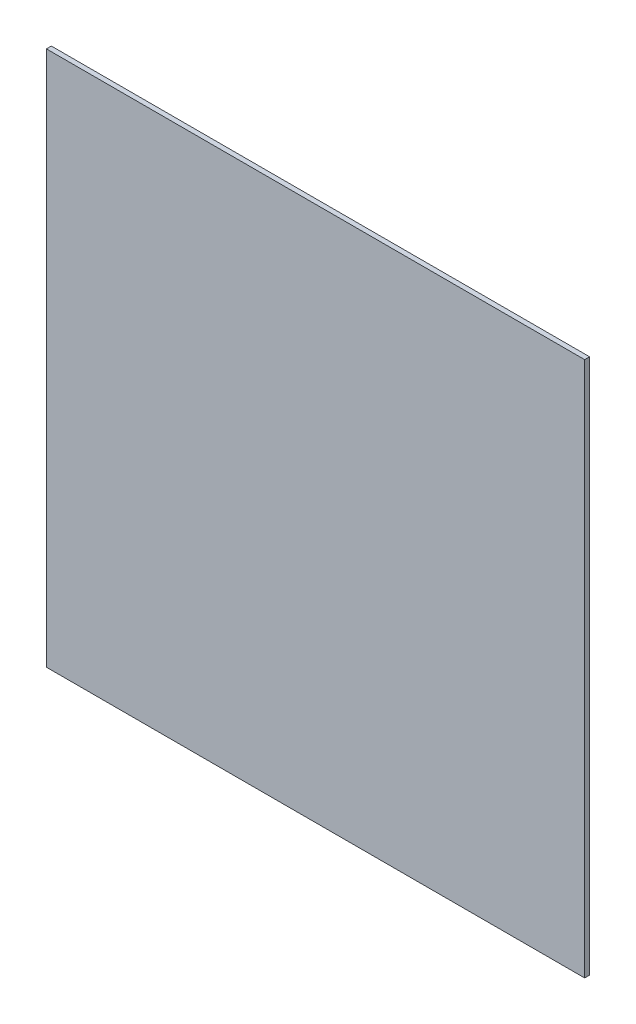
ISO-10303-21;
HEADER;
FILE_DESCRIPTION(('STEP AP214'),'2;1');
FILE_NAME('part.step','',(''),(''),'','','');
FILE_SCHEMA(('AUTOMOTIVE_DESIGN { 1 0 10303 214 1 1 1 1 }'));
ENDSEC;
DATA;
#1=APPLICATION_CONTEXT('core data for automotive mechanical design processes');
#2=APPLICATION_PROTOCOL_DEFINITION('international standard','automotive_design',2000,#1);
#3=PRODUCT_CONTEXT('',#1,'mechanical');
#4=PRODUCT('Part','Part','',(#3));
#5=PRODUCT_RELATED_PRODUCT_CATEGORY('part','',(#4));
#6=PRODUCT_DEFINITION_FORMATION('','',#4);
#7=PRODUCT_DEFINITION_CONTEXT('part definition',#1,'design');
#8=PRODUCT_DEFINITION('design','',#6,#7);
#9=PRODUCT_DEFINITION_SHAPE('','',#8);
#10=(LENGTH_UNIT() NAMED_UNIT(*) SI_UNIT(.MILLI.,.METRE.));
#11=(NAMED_UNIT(*) PLANE_ANGLE_UNIT() SI_UNIT($,.RADIAN.));
#12=(NAMED_UNIT(*) SI_UNIT($,.STERADIAN.) SOLID_ANGLE_UNIT());
#13=UNCERTAINTY_MEASURE_WITH_UNIT(LENGTH_MEASURE(1.E-05),#10,'distance_accuracy_value','');
#14=(GEOMETRIC_REPRESENTATION_CONTEXT(3) GLOBAL_UNCERTAINTY_ASSIGNED_CONTEXT((#13)) GLOBAL_UNIT_ASSIGNED_CONTEXT((#10,
#11,#12)) REPRESENTATION_CONTEXT('',''));
#15=CARTESIAN_POINT('',(0.,0.,0.));
#16=DIRECTION('',(0.,0.,1.));
#17=DIRECTION('',(1.,0.,0.));
#18=AXIS2_PLACEMENT_3D('',#15,#16,#17);
#19=CARTESIAN_POINT('',(304.8,-303.2125,5.588));
#20=DIRECTION('',(-1.,0.,0.));
#21=DIRECTION('',(0.,0.,1.));
#22=AXIS2_PLACEMENT_3D('',#19,#20,#21);
#23=PLANE('',#22);
#24=DIRECTION('',(0.,1.,0.));
#25=VECTOR('',#24,1.);
#26=CARTESIAN_POINT('',(304.8,-303.2125,0.));
#27=LINE('',#26,#25);
#28=CARTESIAN_POINT('',(304.8,-303.2125,0.));
#29=VERTEX_POINT('',#28);
#30=CARTESIAN_POINT('',(304.8,303.2125,0.));
#31=VERTEX_POINT('',#30);
#32=EDGE_CURVE('E104',#29,#31,#27,.T.);
#33=ORIENTED_EDGE('',*,*,#32,.T.);
#34=DIRECTION('',(0.,0.,-1.));
#35=VECTOR('',#34,1.);
#36=CARTESIAN_POINT('',(304.8,303.2125,5.588));
#37=LINE('',#36,#35);
#38=CARTESIAN_POINT('',(304.8,303.2125,5.588));
#39=VERTEX_POINT('',#38);
#40=EDGE_CURVE('E11',#39,#31,#37,.T.);
#41=ORIENTED_EDGE('',*,*,#40,.F.);
#42=DIRECTION('',(0.,1.,0.));
#43=VECTOR('',#42,1.);
#44=CARTESIAN_POINT('',(304.8,-303.2125,5.588));
#45=LINE('',#44,#43);
#46=CARTESIAN_POINT('',(304.8,-303.2125,5.588));
#47=VERTEX_POINT('',#46);
#48=EDGE_CURVE('E92',#47,#39,#45,.T.);
#49=ORIENTED_EDGE('',*,*,#48,.F.);
#50=DIRECTION('',(0.,0.,-1.));
#51=VECTOR('',#50,1.);
#52=CARTESIAN_POINT('',(304.8,-303.2125,5.588));
#53=LINE('',#52,#51);
#54=EDGE_CURVE('E100',#47,#29,#53,.T.);
#55=ORIENTED_EDGE('',*,*,#54,.T.);
#56=EDGE_LOOP('',(#33,#41,#49,#55));
#57=FACE_BOUND('',#56,.T.);
#58=ADVANCED_FACE('F41',(#57),#23,.F.);
#59=CARTESIAN_POINT('',(-304.8,303.2125,5.588));
#60=DIRECTION('',(0.,-1.,0.));
#61=DIRECTION('',(0.,0.,-1.));
#62=AXIS2_PLACEMENT_3D('',#59,#60,#61);
#63=PLANE('',#62);
#64=DIRECTION('',(-1.,0.,0.));
#65=VECTOR('',#64,1.);
#66=CARTESIAN_POINT('',(-304.8,303.2125,0.));
#67=LINE('',#66,#65);
#68=CARTESIAN_POINT('',(-304.8,303.2125,0.));
#69=VERTEX_POINT('',#68);
#70=EDGE_CURVE('E96',#31,#69,#67,.T.);
#71=ORIENTED_EDGE('',*,*,#70,.T.);
#72=DIRECTION('',(0.,0.,-1.));
#73=VECTOR('',#72,1.);
#74=CARTESIAN_POINT('',(-304.8,303.2125,5.588));
#75=LINE('',#74,#73);
#76=CARTESIAN_POINT('',(-304.8,303.2125,5.588));
#77=VERTEX_POINT('',#76);
#78=EDGE_CURVE('E49',#77,#69,#75,.T.);
#79=ORIENTED_EDGE('',*,*,#78,.F.);
#80=DIRECTION('',(-1.,0.,0.));
#81=VECTOR('',#80,1.);
#82=CARTESIAN_POINT('',(-304.8,303.2125,5.588));
#83=LINE('',#82,#81);
#84=EDGE_CURVE('E87',#39,#77,#83,.T.);
#85=ORIENTED_EDGE('',*,*,#84,.F.);
#86=ORIENTED_EDGE('',*,*,#40,.T.);
#87=EDGE_LOOP('',(#71,#79,#85,#86));
#88=FACE_BOUND('',#87,.T.);
#89=ADVANCED_FACE('F95',(#88),#63,.F.);
#90=CARTESIAN_POINT('',(-304.8,-303.2125,5.588));
#91=DIRECTION('',(1.,0.,0.));
#92=DIRECTION('',(0.,0.,-1.));
#93=AXIS2_PLACEMENT_3D('',#90,#91,#92);
#94=PLANE('',#93);
#95=DIRECTION('',(0.,-1.,0.));
#96=VECTOR('',#95,1.);
#97=CARTESIAN_POINT('',(-304.8,-303.2125,0.));
#98=LINE('',#97,#96);
#99=CARTESIAN_POINT('',(-304.8,-303.2125,0.));
#100=VERTEX_POINT('',#99);
#101=EDGE_CURVE('E74',#69,#100,#98,.T.);
#102=ORIENTED_EDGE('',*,*,#101,.T.);
#103=DIRECTION('',(0.,0.,-1.));
#104=VECTOR('',#103,1.);
#105=CARTESIAN_POINT('',(-304.8,-303.2125,5.588));
#106=LINE('',#105,#104);
#107=CARTESIAN_POINT('',(-304.8,-303.2125,5.588));
#108=VERTEX_POINT('',#107);
#109=EDGE_CURVE('E97',#108,#100,#106,.T.);
#110=ORIENTED_EDGE('',*,*,#109,.F.);
#111=DIRECTION('',(0.,-1.,0.));
#112=VECTOR('',#111,1.);
#113=CARTESIAN_POINT('',(-304.8,-303.2125,5.588));
#114=LINE('',#113,#112);
#115=EDGE_CURVE('E90',#77,#108,#114,.T.);
#116=ORIENTED_EDGE('',*,*,#115,.F.);
#117=ORIENTED_EDGE('',*,*,#78,.T.);
#118=EDGE_LOOP('',(#102,#110,#116,#117));
#119=FACE_BOUND('',#118,.T.);
#120=ADVANCED_FACE('F98',(#119),#94,.F.);
#121=CARTESIAN_POINT('',(-304.8,-303.2125,5.588));
#122=DIRECTION('',(0.,1.,0.));
#123=DIRECTION('',(0.,0.,1.));
#124=AXIS2_PLACEMENT_3D('',#121,#122,#123);
#125=PLANE('',#124);
#126=DIRECTION('',(1.,0.,0.));
#127=VECTOR('',#126,1.);
#128=CARTESIAN_POINT('',(-304.8,-303.2125,0.));
#129=LINE('',#128,#127);
#130=EDGE_CURVE('E80',#100,#29,#129,.T.);
#131=ORIENTED_EDGE('',*,*,#130,.T.);
#132=ORIENTED_EDGE('',*,*,#54,.F.);
#133=DIRECTION('',(1.,0.,0.));
#134=VECTOR('',#133,1.);
#135=CARTESIAN_POINT('',(-304.8,-303.2125,5.588));
#136=LINE('',#135,#134);
#137=EDGE_CURVE('E57',#108,#47,#136,.T.);
#138=ORIENTED_EDGE('',*,*,#137,.F.);
#139=ORIENTED_EDGE('',*,*,#109,.T.);
#140=EDGE_LOOP('',(#131,#132,#138,#139));
#141=FACE_BOUND('',#140,.T.);
#142=ADVANCED_FACE('F111',(#141),#125,.F.);
#143=CARTESIAN_POINT('',(0.,0.,5.588));
#144=DIRECTION('',(0.,0.,-1.));
#145=DIRECTION('',(-1.,0.,0.));
#146=AXIS2_PLACEMENT_3D('',#143,#144,#145);
#147=PLANE('',#146);
#148=ORIENTED_EDGE('',*,*,#48,.T.);
#149=ORIENTED_EDGE('',*,*,#84,.T.);
#150=ORIENTED_EDGE('',*,*,#115,.T.);
#151=ORIENTED_EDGE('',*,*,#137,.T.);
#152=EDGE_LOOP('',(#148,#149,#150,#151));
#153=FACE_BOUND('',#152,.T.);
#154=ADVANCED_FACE('F88',(#153),#147,.F.);
#155=CARTESIAN_POINT('',(0.,0.,0.));
#156=DIRECTION('',(0.,0.,-1.));
#157=DIRECTION('',(-1.,0.,0.));
#158=AXIS2_PLACEMENT_3D('',#155,#156,#157);
#159=PLANE('',#158);
#160=ORIENTED_EDGE('',*,*,#32,.F.);
#161=ORIENTED_EDGE('',*,*,#130,.F.);
#162=ORIENTED_EDGE('',*,*,#101,.F.);
#163=ORIENTED_EDGE('',*,*,#70,.F.);
#164=EDGE_LOOP('',(#160,#161,#162,#163));
#165=FACE_BOUND('',#164,.T.);
#166=ADVANCED_FACE('F114',(#165),#159,.T.);
#167=CLOSED_SHELL('',(#58,#89,#120,#142,#154,#166));
#168=MANIFOLD_SOLID_BREP('B2',#167);
#169=ADVANCED_BREP_SHAPE_REPRESENTATION('',(#18,#168),#14);
#170=SHAPE_DEFINITION_REPRESENTATION(#9,#169);
ENDSEC;
END-ISO-10303-21;
